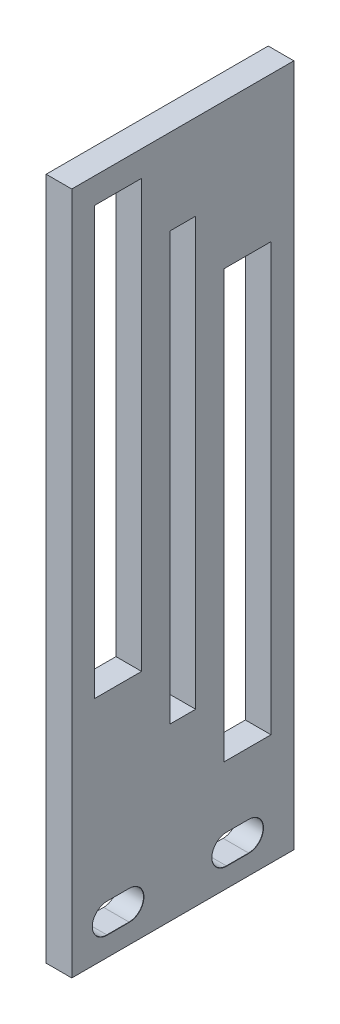
ISO-10303-21;
HEADER;
FILE_DESCRIPTION(('STEP AP214'),'2;1');
FILE_NAME('part.step','',(''),(''),'','','');
FILE_SCHEMA(('AUTOMOTIVE_DESIGN { 1 0 10303 214 1 1 1 1 }'));
ENDSEC;
DATA;
#1=APPLICATION_CONTEXT('core data for automotive mechanical design processes');
#2=APPLICATION_PROTOCOL_DEFINITION('international standard','automotive_design',2000,#1);
#3=PRODUCT_CONTEXT('',#1,'mechanical');
#4=PRODUCT('Part','Part','',(#3));
#5=PRODUCT_RELATED_PRODUCT_CATEGORY('part','',(#4));
#6=PRODUCT_DEFINITION_FORMATION('','',#4);
#7=PRODUCT_DEFINITION_CONTEXT('part definition',#1,'design');
#8=PRODUCT_DEFINITION('design','',#6,#7);
#9=PRODUCT_DEFINITION_SHAPE('','',#8);
#10=(LENGTH_UNIT() NAMED_UNIT(*) SI_UNIT(.MILLI.,.METRE.));
#11=(NAMED_UNIT(*) PLANE_ANGLE_UNIT() SI_UNIT($,.RADIAN.));
#12=(NAMED_UNIT(*) SI_UNIT($,.STERADIAN.) SOLID_ANGLE_UNIT());
#13=UNCERTAINTY_MEASURE_WITH_UNIT(LENGTH_MEASURE(1.E-05),#10,'distance_accuracy_value','');
#14=(GEOMETRIC_REPRESENTATION_CONTEXT(3) GLOBAL_UNCERTAINTY_ASSIGNED_CONTEXT((#13)) GLOBAL_UNIT_ASSIGNED_CONTEXT((#10,
#11,#12)) REPRESENTATION_CONTEXT('',''));
#15=CARTESIAN_POINT('',(0.,0.,0.));
#16=DIRECTION('',(0.,0.,1.));
#17=DIRECTION('',(1.,0.,0.));
#18=AXIS2_PLACEMENT_3D('',#15,#16,#17);
#19=CARTESIAN_POINT('',(3.,0.,0.));
#20=DIRECTION('',(0.,0.,-1.));
#21=DIRECTION('',(-1.,0.,0.));
#22=AXIS2_PLACEMENT_3D('',#19,#20,#21);
#23=PLANE('',#22);
#24=DIRECTION('',(0.,-1.,0.));
#25=VECTOR('',#24,1.);
#26=CARTESIAN_POINT('',(0.,0.,0.));
#27=LINE('',#26,#25);
#28=CARTESIAN_POINT('',(0.,80.,0.));
#29=VERTEX_POINT('',#28);
#30=CARTESIAN_POINT('',(0.,0.,0.));
#31=VERTEX_POINT('',#30);
#32=EDGE_CURVE('E540',#29,#31,#27,.T.);
#33=ORIENTED_EDGE('',*,*,#32,.T.);
#34=DIRECTION('',(-1.,0.,0.));
#35=VECTOR('',#34,1.);
#36=CARTESIAN_POINT('',(3.,0.,0.));
#37=LINE('',#36,#35);
#38=CARTESIAN_POINT('',(3.,0.,0.));
#39=VERTEX_POINT('',#38);
#40=EDGE_CURVE('E14',#39,#31,#37,.T.);
#41=ORIENTED_EDGE('',*,*,#40,.F.);
#42=DIRECTION('',(0.,-1.,0.));
#43=VECTOR('',#42,1.);
#44=CARTESIAN_POINT('',(3.,0.,0.));
#45=LINE('',#44,#43);
#46=CARTESIAN_POINT('',(3.,80.,0.));
#47=VERTEX_POINT('',#46);
#48=EDGE_CURVE('E625',#47,#39,#45,.T.);
#49=ORIENTED_EDGE('',*,*,#48,.F.);
#50=DIRECTION('',(-1.,0.,0.));
#51=VECTOR('',#50,1.);
#52=CARTESIAN_POINT('',(3.,80.,0.));
#53=LINE('',#52,#51);
#54=EDGE_CURVE('E642',#47,#29,#53,.T.);
#55=ORIENTED_EDGE('',*,*,#54,.T.);
#56=EDGE_LOOP('',(#33,#41,#49,#55));
#57=FACE_BOUND('',#56,.T.);
#58=ADVANCED_FACE('F185',(#57),#23,.F.);
#59=CARTESIAN_POINT('',(3.,0.,0.));
#60=DIRECTION('',(0.,1.,0.));
#61=DIRECTION('',(0.,0.,1.));
#62=AXIS2_PLACEMENT_3D('',#59,#60,#61);
#63=PLANE('',#62);
#64=DIRECTION('',(0.,0.,-1.));
#65=VECTOR('',#64,1.);
#66=CARTESIAN_POINT('',(0.,0.,0.));
#67=LINE('',#66,#65);
#68=CARTESIAN_POINT('',(0.,0.,-26.));
#69=VERTEX_POINT('',#68);
#70=EDGE_CURVE('E645',#31,#69,#67,.T.);
#71=ORIENTED_EDGE('',*,*,#70,.T.);
#72=DIRECTION('',(-1.,0.,0.));
#73=VECTOR('',#72,1.);
#74=CARTESIAN_POINT('',(3.,0.,-26.));
#75=LINE('',#74,#73);
#76=CARTESIAN_POINT('',(3.,0.,-26.));
#77=VERTEX_POINT('',#76);
#78=EDGE_CURVE('E192',#77,#69,#75,.T.);
#79=ORIENTED_EDGE('',*,*,#78,.F.);
#80=DIRECTION('',(0.,0.,-1.));
#81=VECTOR('',#80,1.);
#82=CARTESIAN_POINT('',(3.,0.,0.));
#83=LINE('',#82,#81);
#84=EDGE_CURVE('E630',#39,#77,#83,.T.);
#85=ORIENTED_EDGE('',*,*,#84,.F.);
#86=ORIENTED_EDGE('',*,*,#40,.T.);
#87=EDGE_LOOP('',(#71,#79,#85,#86));
#88=FACE_BOUND('',#87,.T.);
#89=ADVANCED_FACE('F757',(#88),#63,.F.);
#90=CARTESIAN_POINT('',(3.,0.,-26.));
#91=DIRECTION('',(0.,0.,1.));
#92=DIRECTION('',(1.,0.,0.));
#93=AXIS2_PLACEMENT_3D('',#90,#91,#92);
#94=PLANE('',#93);
#95=DIRECTION('',(0.,1.,0.));
#96=VECTOR('',#95,1.);
#97=CARTESIAN_POINT('',(0.,0.,-26.));
#98=LINE('',#97,#96);
#99=CARTESIAN_POINT('',(0.,80.,-26.));
#100=VERTEX_POINT('',#99);
#101=EDGE_CURVE('E647',#69,#100,#98,.T.);
#102=ORIENTED_EDGE('',*,*,#101,.T.);
#103=DIRECTION('',(-1.,0.,0.));
#104=VECTOR('',#103,1.);
#105=CARTESIAN_POINT('',(3.,80.,-26.));
#106=LINE('',#105,#104);
#107=CARTESIAN_POINT('',(3.,80.,-26.));
#108=VERTEX_POINT('',#107);
#109=EDGE_CURVE('E652',#108,#100,#106,.T.);
#110=ORIENTED_EDGE('',*,*,#109,.F.);
#111=DIRECTION('',(0.,1.,0.));
#112=VECTOR('',#111,1.);
#113=CARTESIAN_POINT('',(3.,0.,-26.));
#114=LINE('',#113,#112);
#115=EDGE_CURVE('E635',#77,#108,#114,.T.);
#116=ORIENTED_EDGE('',*,*,#115,.F.);
#117=ORIENTED_EDGE('',*,*,#78,.T.);
#118=EDGE_LOOP('',(#102,#110,#116,#117));
#119=FACE_BOUND('',#118,.T.);
#120=ADVANCED_FACE('F659',(#119),#94,.F.);
#121=CARTESIAN_POINT('',(3.,80.,0.));
#122=DIRECTION('',(0.,-1.,0.));
#123=DIRECTION('',(0.,0.,-1.));
#124=AXIS2_PLACEMENT_3D('',#121,#122,#123);
#125=PLANE('',#124);
#126=DIRECTION('',(0.,0.,1.));
#127=VECTOR('',#126,1.);
#128=CARTESIAN_POINT('',(0.,80.,0.));
#129=LINE('',#128,#127);
#130=EDGE_CURVE('E631',#100,#29,#129,.T.);
#131=ORIENTED_EDGE('',*,*,#130,.T.);
#132=ORIENTED_EDGE('',*,*,#54,.F.);
#133=DIRECTION('',(0.,0.,1.));
#134=VECTOR('',#133,1.);
#135=CARTESIAN_POINT('',(3.,80.,0.));
#136=LINE('',#135,#134);
#137=EDGE_CURVE('E638',#108,#47,#136,.T.);
#138=ORIENTED_EDGE('',*,*,#137,.F.);
#139=ORIENTED_EDGE('',*,*,#109,.T.);
#140=EDGE_LOOP('',(#131,#132,#138,#139));
#141=FACE_BOUND('',#140,.T.);
#142=ADVANCED_FACE('F667',(#141),#125,.F.);
#143=CARTESIAN_POINT('',(3.,0.,0.));
#144=DIRECTION('',(-1.,0.,0.));
#145=DIRECTION('',(0.,0.,1.));
#146=AXIS2_PLACEMENT_3D('',#143,#144,#145);
#147=PLANE('',#146);
#148=DIRECTION('',(0.,0.,1.));
#149=VECTOR('',#148,1.);
#150=CARTESIAN_POINT('',(3.,2.275,-6.725));
#151=LINE('',#150,#149);
#152=CARTESIAN_POINT('',(3.,2.27499999999994,-6.725));
#153=VERTEX_POINT('',#152);
#154=CARTESIAN_POINT('',(3.,2.275,-4.125));
#155=VERTEX_POINT('',#154);
#156=EDGE_CURVE('E400',#153,#155,#151,.T.);
#157=ORIENTED_EDGE('',*,*,#156,.T.);
#158=CARTESIAN_POINT('',(3.,4.,-4.125));
#159=DIRECTION('',(1.,0.,0.));
#160=DIRECTION('',(0.,0.,-1.));
#161=AXIS2_PLACEMENT_3D('',#158,#159,#160);
#162=CIRCLE('',#161,1.725);
#163=CARTESIAN_POINT('',(3.,5.72499999999999,-4.125));
#164=VERTEX_POINT('',#163);
#165=EDGE_CURVE('E689',#164,#155,#162,.T.);
#166=ORIENTED_EDGE('',*,*,#165,.F.);
#167=DIRECTION('',(0.,0.,1.));
#168=VECTOR('',#167,1.);
#169=CARTESIAN_POINT('',(3.,5.72499999999999,-6.725));
#170=LINE('',#169,#168);
#171=CARTESIAN_POINT('',(3.,5.725,-6.725));
#172=VERTEX_POINT('',#171);
#173=EDGE_CURVE('E394',#172,#164,#170,.T.);
#174=ORIENTED_EDGE('',*,*,#173,.F.);
#175=CARTESIAN_POINT('',(3.,4.,-6.725));
#176=DIRECTION('',(1.,0.,0.));
#177=DIRECTION('',(0.,0.,-1.));
#178=AXIS2_PLACEMENT_3D('',#175,#176,#177);
#179=CIRCLE('',#178,1.725);
#180=EDGE_CURVE('E378',#153,#172,#179,.T.);
#181=ORIENTED_EDGE('',*,*,#180,.F.);
#182=EDGE_LOOP('',(#157,#166,#174,#181));
#183=FACE_BOUND('',#182,.T.);
#184=CARTESIAN_POINT('',(3.,4.,-20.725));
#185=DIRECTION('',(1.,0.,0.));
#186=DIRECTION('',(0.,0.,-1.));
#187=AXIS2_PLACEMENT_3D('',#184,#185,#186);
#188=CIRCLE('',#187,1.725);
#189=CARTESIAN_POINT('',(3.,2.27499999999994,-20.725));
#190=VERTEX_POINT('',#189);
#191=CARTESIAN_POINT('',(3.,5.725,-20.725));
#192=VERTEX_POINT('',#191);
#193=EDGE_CURVE('E416',#190,#192,#188,.T.);
#194=ORIENTED_EDGE('',*,*,#193,.F.);
#195=DIRECTION('',(0.,0.,1.));
#196=VECTOR('',#195,1.);
#197=CARTESIAN_POINT('',(3.,2.275,-20.725));
#198=LINE('',#197,#196);
#199=CARTESIAN_POINT('',(3.,2.275,-18.125));
#200=VERTEX_POINT('',#199);
#201=EDGE_CURVE('E469',#190,#200,#198,.T.);
#202=ORIENTED_EDGE('',*,*,#201,.T.);
#203=CARTESIAN_POINT('',(3.,4.,-18.125));
#204=DIRECTION('',(1.,0.,0.));
#205=DIRECTION('',(0.,0.,-1.));
#206=AXIS2_PLACEMENT_3D('',#203,#204,#205);
#207=CIRCLE('',#206,1.725);
#208=CARTESIAN_POINT('',(3.,5.72499999999999,-18.125));
#209=VERTEX_POINT('',#208);
#210=EDGE_CURVE('E441',#209,#200,#207,.T.);
#211=ORIENTED_EDGE('',*,*,#210,.F.);
#212=DIRECTION('',(0.,0.,1.));
#213=VECTOR('',#212,1.);
#214=CARTESIAN_POINT('',(3.,5.72499999999999,-20.725));
#215=LINE('',#214,#213);
#216=EDGE_CURVE('E453',#192,#209,#215,.T.);
#217=ORIENTED_EDGE('',*,*,#216,.F.);
#218=EDGE_LOOP('',(#194,#202,#211,#217));
#219=FACE_BOUND('',#218,.T.);
#220=DIRECTION('',(0.,0.,-1.));
#221=VECTOR('',#220,1.);
#222=CARTESIAN_POINT('',(3.,27.,-2.67500000000001));
#223=LINE('',#222,#221);
#224=CARTESIAN_POINT('',(3.,27.,-2.67500000000001));
#225=VERTEX_POINT('',#224);
#226=CARTESIAN_POINT('',(3.,27.,-8.17499999999999));
#227=VERTEX_POINT('',#226);
#228=EDGE_CURVE('E524',#225,#227,#223,.T.);
#229=ORIENTED_EDGE('',*,*,#228,.F.);
#230=DIRECTION('',(0.,-1.,0.));
#231=VECTOR('',#230,1.);
#232=CARTESIAN_POINT('',(3.,77.,-2.675));
#233=LINE('',#232,#231);
#234=CARTESIAN_POINT('',(3.,77.,-2.675));
#235=VERTEX_POINT('',#234);
#236=EDGE_CURVE('E521',#235,#225,#233,.T.);
#237=ORIENTED_EDGE('',*,*,#236,.F.);
#238=DIRECTION('',(0.,0.,1.));
#239=VECTOR('',#238,1.);
#240=CARTESIAN_POINT('',(3.,77.,-2.675));
#241=LINE('',#240,#239);
#242=CARTESIAN_POINT('',(3.,77.,-8.175));
#243=VERTEX_POINT('',#242);
#244=EDGE_CURVE('E511',#243,#235,#241,.T.);
#245=ORIENTED_EDGE('',*,*,#244,.F.);
#246=DIRECTION('',(0.,1.,0.));
#247=VECTOR('',#246,1.);
#248=CARTESIAN_POINT('',(3.,77.,-8.175));
#249=LINE('',#248,#247);
#250=EDGE_CURVE('E536',#227,#243,#249,.T.);
#251=ORIENTED_EDGE('',*,*,#250,.F.);
#252=EDGE_LOOP('',(#229,#237,#245,#251));
#253=FACE_BOUND('',#252,.T.);
#254=DIRECTION('',(0.,0.,-1.));
#255=VECTOR('',#254,1.);
#256=CARTESIAN_POINT('',(3.,20.,-11.5));
#257=LINE('',#256,#255);
#258=CARTESIAN_POINT('',(3.,20.,-11.5));
#259=VERTEX_POINT('',#258);
#260=CARTESIAN_POINT('',(3.,20.,-14.5));
#261=VERTEX_POINT('',#260);
#262=EDGE_CURVE('E565',#259,#261,#257,.T.);
#263=ORIENTED_EDGE('',*,*,#262,.F.);
#264=DIRECTION('',(0.,-1.,0.));
#265=VECTOR('',#264,1.);
#266=CARTESIAN_POINT('',(3.,70.,-11.5));
#267=LINE('',#266,#265);
#268=CARTESIAN_POINT('',(3.,70.,-11.5));
#269=VERTEX_POINT('',#268);
#270=EDGE_CURVE('E561',#269,#259,#267,.T.);
#271=ORIENTED_EDGE('',*,*,#270,.F.);
#272=DIRECTION('',(0.,0.,1.));
#273=VECTOR('',#272,1.);
#274=CARTESIAN_POINT('',(3.,70.,-11.5));
#275=LINE('',#274,#273);
#276=CARTESIAN_POINT('',(3.,70.,-14.5));
#277=VERTEX_POINT('',#276);
#278=EDGE_CURVE('E551',#277,#269,#275,.T.);
#279=ORIENTED_EDGE('',*,*,#278,.F.);
#280=DIRECTION('',(0.,1.,0.));
#281=VECTOR('',#280,1.);
#282=CARTESIAN_POINT('',(3.,70.,-14.5));
#283=LINE('',#282,#281);
#284=EDGE_CURVE('E578',#261,#277,#283,.T.);
#285=ORIENTED_EDGE('',*,*,#284,.F.);
#286=EDGE_LOOP('',(#263,#271,#279,#285));
#287=FACE_BOUND('',#286,.T.);
#288=DIRECTION('',(0.,0.,-1.));
#289=VECTOR('',#288,1.);
#290=CARTESIAN_POINT('',(3.,13.,-17.825));
#291=LINE('',#290,#289);
#292=CARTESIAN_POINT('',(3.,13.,-17.825));
#293=VERTEX_POINT('',#292);
#294=CARTESIAN_POINT('',(3.,13.,-23.325));
#295=VERTEX_POINT('',#294);
#296=EDGE_CURVE('E604',#293,#295,#291,.T.);
#297=ORIENTED_EDGE('',*,*,#296,.F.);
#298=DIRECTION('',(0.,-1.,0.));
#299=VECTOR('',#298,1.);
#300=CARTESIAN_POINT('',(3.,63.,-17.825));
#301=LINE('',#300,#299);
#302=CARTESIAN_POINT('',(3.,63.,-17.825));
#303=VERTEX_POINT('',#302);
#304=EDGE_CURVE('E504',#303,#293,#301,.T.);
#305=ORIENTED_EDGE('',*,*,#304,.F.);
#306=DIRECTION('',(0.,0.,1.));
#307=VECTOR('',#306,1.);
#308=CARTESIAN_POINT('',(3.,63.,-17.825));
#309=LINE('',#308,#307);
#310=CARTESIAN_POINT('',(3.,63.,-23.325));
#311=VERTEX_POINT('',#310);
#312=EDGE_CURVE('E591',#311,#303,#309,.T.);
#313=ORIENTED_EDGE('',*,*,#312,.F.);
#314=DIRECTION('',(0.,1.,0.));
#315=VECTOR('',#314,1.);
#316=CARTESIAN_POINT('',(3.,63.,-23.325));
#317=LINE('',#316,#315);
#318=EDGE_CURVE('E616',#295,#311,#317,.T.);
#319=ORIENTED_EDGE('',*,*,#318,.F.);
#320=EDGE_LOOP('',(#297,#305,#313,#319));
#321=FACE_BOUND('',#320,.T.);
#322=ORIENTED_EDGE('',*,*,#48,.T.);
#323=ORIENTED_EDGE('',*,*,#84,.T.);
#324=ORIENTED_EDGE('',*,*,#115,.T.);
#325=ORIENTED_EDGE('',*,*,#137,.T.);
#326=EDGE_LOOP('',(#322,#323,#324,#325));
#327=FACE_BOUND('',#326,.T.);
#328=ADVANCED_FACE('F673',(#183,#219,#253,#287,#321,#327),#147,.F.);
#329=CARTESIAN_POINT('',(0.,0.,0.));
#330=DIRECTION('',(-1.,0.,0.));
#331=DIRECTION('',(0.,0.,1.));
#332=AXIS2_PLACEMENT_3D('',#329,#330,#331);
#333=PLANE('',#332);
#334=DIRECTION('',(0.,0.,1.));
#335=VECTOR('',#334,1.);
#336=CARTESIAN_POINT('',(0.,2.3,-6.725));
#337=LINE('',#336,#335);
#338=CARTESIAN_POINT('',(0.,2.3,-6.725));
#339=VERTEX_POINT('',#338);
#340=CARTESIAN_POINT('',(0.,2.3,-4.125));
#341=VERTEX_POINT('',#340);
#342=EDGE_CURVE('E698',#339,#341,#337,.T.);
#343=ORIENTED_EDGE('',*,*,#342,.F.);
#344=CARTESIAN_POINT('',(0.,4.,-6.725));
#345=DIRECTION('',(1.,0.,0.));
#346=DIRECTION('',(0.,0.,-1.));
#347=AXIS2_PLACEMENT_3D('',#344,#345,#346);
#348=CIRCLE('',#347,1.7);
#349=CARTESIAN_POINT('',(0.,5.7,-6.725));
#350=VERTEX_POINT('',#349);
#351=EDGE_CURVE('E388',#339,#350,#348,.T.);
#352=ORIENTED_EDGE('',*,*,#351,.T.);
#353=DIRECTION('',(0.,0.,1.));
#354=VECTOR('',#353,1.);
#355=CARTESIAN_POINT('',(0.,5.7,-6.725));
#356=LINE('',#355,#354);
#357=CARTESIAN_POINT('',(0.,5.7,-4.125));
#358=VERTEX_POINT('',#357);
#359=EDGE_CURVE('E374',#350,#358,#356,.T.);
#360=ORIENTED_EDGE('',*,*,#359,.T.);
#361=CARTESIAN_POINT('',(0.,4.,-4.125));
#362=DIRECTION('',(1.,0.,0.));
#363=DIRECTION('',(0.,0.,-1.));
#364=AXIS2_PLACEMENT_3D('',#361,#362,#363);
#365=CIRCLE('',#364,1.7);
#366=EDGE_CURVE('E708',#358,#341,#365,.T.);
#367=ORIENTED_EDGE('',*,*,#366,.T.);
#368=EDGE_LOOP('',(#343,#352,#360,#367));
#369=FACE_BOUND('',#368,.T.);
#370=CARTESIAN_POINT('',(0.,4.,-18.125));
#371=DIRECTION('',(1.,0.,0.));
#372=DIRECTION('',(0.,0.,-1.));
#373=AXIS2_PLACEMENT_3D('',#370,#371,#372);
#374=CIRCLE('',#373,1.7);
#375=CARTESIAN_POINT('',(0.,5.7,-18.125));
#376=VERTEX_POINT('',#375);
#377=CARTESIAN_POINT('',(0.,2.3,-18.125));
#378=VERTEX_POINT('',#377);
#379=EDGE_CURVE('E491',#376,#378,#374,.T.);
#380=ORIENTED_EDGE('',*,*,#379,.T.);
#381=DIRECTION('',(0.,0.,1.));
#382=VECTOR('',#381,1.);
#383=CARTESIAN_POINT('',(0.,2.3,-20.725));
#384=LINE('',#383,#382);
#385=CARTESIAN_POINT('',(0.,2.3,-20.725));
#386=VERTEX_POINT('',#385);
#387=EDGE_CURVE('E466',#386,#378,#384,.T.);
#388=ORIENTED_EDGE('',*,*,#387,.F.);
#389=CARTESIAN_POINT('',(0.,4.,-20.725));
#390=DIRECTION('',(1.,0.,0.));
#391=DIRECTION('',(0.,0.,-1.));
#392=AXIS2_PLACEMENT_3D('',#389,#390,#391);
#393=CIRCLE('',#392,1.7);
#394=CARTESIAN_POINT('',(0.,5.7,-20.725));
#395=VERTEX_POINT('',#394);
#396=EDGE_CURVE('E427',#386,#395,#393,.T.);
#397=ORIENTED_EDGE('',*,*,#396,.T.);
#398=DIRECTION('',(0.,0.,1.));
#399=VECTOR('',#398,1.);
#400=CARTESIAN_POINT('',(0.,5.7,-20.725));
#401=LINE('',#400,#399);
#402=EDGE_CURVE('E463',#395,#376,#401,.T.);
#403=ORIENTED_EDGE('',*,*,#402,.T.);
#404=EDGE_LOOP('',(#380,#388,#397,#403));
#405=FACE_BOUND('',#404,.T.);
#406=DIRECTION('',(0.,-1.,0.));
#407=VECTOR('',#406,1.);
#408=CARTESIAN_POINT('',(0.,77.,-2.675));
#409=LINE('',#408,#407);
#410=CARTESIAN_POINT('',(0.,77.,-2.675));
#411=VERTEX_POINT('',#410);
#412=CARTESIAN_POINT('',(0.,27.,-2.67500000000001));
#413=VERTEX_POINT('',#412);
#414=EDGE_CURVE('E507',#411,#413,#409,.T.);
#415=ORIENTED_EDGE('',*,*,#414,.T.);
#416=DIRECTION('',(0.,0.,-1.));
#417=VECTOR('',#416,1.);
#418=CARTESIAN_POINT('',(0.,27.,-2.67500000000001));
#419=LINE('',#418,#417);
#420=CARTESIAN_POINT('',(0.,27.,-8.17499999999999));
#421=VERTEX_POINT('',#420);
#422=EDGE_CURVE('E510',#413,#421,#419,.T.);
#423=ORIENTED_EDGE('',*,*,#422,.T.);
#424=DIRECTION('',(0.,1.,0.));
#425=VECTOR('',#424,1.);
#426=CARTESIAN_POINT('',(0.,77.,-8.175));
#427=LINE('',#426,#425);
#428=CARTESIAN_POINT('',(0.,77.,-8.175));
#429=VERTEX_POINT('',#428);
#430=EDGE_CURVE('E514',#421,#429,#427,.T.);
#431=ORIENTED_EDGE('',*,*,#430,.T.);
#432=DIRECTION('',(0.,0.,1.));
#433=VECTOR('',#432,1.);
#434=CARTESIAN_POINT('',(0.,77.,-2.675));
#435=LINE('',#434,#433);
#436=EDGE_CURVE('E517',#429,#411,#435,.T.);
#437=ORIENTED_EDGE('',*,*,#436,.T.);
#438=EDGE_LOOP('',(#415,#423,#431,#437));
#439=FACE_BOUND('',#438,.T.);
#440=DIRECTION('',(0.,-1.,0.));
#441=VECTOR('',#440,1.);
#442=CARTESIAN_POINT('',(0.,70.,-11.5));
#443=LINE('',#442,#441);
#444=CARTESIAN_POINT('',(0.,70.,-11.5));
#445=VERTEX_POINT('',#444);
#446=CARTESIAN_POINT('',(0.,20.,-11.5));
#447=VERTEX_POINT('',#446);
#448=EDGE_CURVE('E547',#445,#447,#443,.T.);
#449=ORIENTED_EDGE('',*,*,#448,.T.);
#450=DIRECTION('',(0.,0.,-1.));
#451=VECTOR('',#450,1.);
#452=CARTESIAN_POINT('',(0.,20.,-11.5));
#453=LINE('',#452,#451);
#454=CARTESIAN_POINT('',(0.,20.,-14.5));
#455=VERTEX_POINT('',#454);
#456=EDGE_CURVE('E550',#447,#455,#453,.T.);
#457=ORIENTED_EDGE('',*,*,#456,.T.);
#458=DIRECTION('',(0.,1.,0.));
#459=VECTOR('',#458,1.);
#460=CARTESIAN_POINT('',(0.,70.,-14.5));
#461=LINE('',#460,#459);
#462=CARTESIAN_POINT('',(0.,70.,-14.5));
#463=VERTEX_POINT('',#462);
#464=EDGE_CURVE('E554',#455,#463,#461,.T.);
#465=ORIENTED_EDGE('',*,*,#464,.T.);
#466=DIRECTION('',(0.,0.,1.));
#467=VECTOR('',#466,1.);
#468=CARTESIAN_POINT('',(0.,70.,-11.5));
#469=LINE('',#468,#467);
#470=EDGE_CURVE('E557',#463,#445,#469,.T.);
#471=ORIENTED_EDGE('',*,*,#470,.T.);
#472=EDGE_LOOP('',(#449,#457,#465,#471));
#473=FACE_BOUND('',#472,.T.);
#474=DIRECTION('',(0.,-1.,0.));
#475=VECTOR('',#474,1.);
#476=CARTESIAN_POINT('',(0.,63.,-17.825));
#477=LINE('',#476,#475);
#478=CARTESIAN_POINT('',(0.,63.,-17.825));
#479=VERTEX_POINT('',#478);
#480=CARTESIAN_POINT('',(0.,13.,-17.825));
#481=VERTEX_POINT('',#480);
#482=EDGE_CURVE('E587',#479,#481,#477,.T.);
#483=ORIENTED_EDGE('',*,*,#482,.T.);
#484=DIRECTION('',(0.,0.,-1.));
#485=VECTOR('',#484,1.);
#486=CARTESIAN_POINT('',(0.,13.,-17.825));
#487=LINE('',#486,#485);
#488=CARTESIAN_POINT('',(0.,13.,-23.325));
#489=VERTEX_POINT('',#488);
#490=EDGE_CURVE('E590',#481,#489,#487,.T.);
#491=ORIENTED_EDGE('',*,*,#490,.T.);
#492=DIRECTION('',(0.,1.,0.));
#493=VECTOR('',#492,1.);
#494=CARTESIAN_POINT('',(0.,63.,-23.325));
#495=LINE('',#494,#493);
#496=CARTESIAN_POINT('',(0.,63.,-23.325));
#497=VERTEX_POINT('',#496);
#498=EDGE_CURVE('E594',#489,#497,#495,.T.);
#499=ORIENTED_EDGE('',*,*,#498,.T.);
#500=DIRECTION('',(0.,0.,1.));
#501=VECTOR('',#500,1.);
#502=CARTESIAN_POINT('',(0.,63.,-17.825));
#503=LINE('',#502,#501);
#504=EDGE_CURVE('E597',#497,#479,#503,.T.);
#505=ORIENTED_EDGE('',*,*,#504,.T.);
#506=EDGE_LOOP('',(#483,#491,#499,#505));
#507=FACE_BOUND('',#506,.T.);
#508=ORIENTED_EDGE('',*,*,#32,.F.);
#509=ORIENTED_EDGE('',*,*,#130,.F.);
#510=ORIENTED_EDGE('',*,*,#101,.F.);
#511=ORIENTED_EDGE('',*,*,#70,.F.);
#512=EDGE_LOOP('',(#508,#509,#510,#511));
#513=FACE_BOUND('',#512,.T.);
#514=ADVANCED_FACE('F489',(#369,#405,#439,#473,#507,#513),#333,.T.);
#515=CARTESIAN_POINT('',(0.,63.,-17.825));
#516=DIRECTION('',(0.,0.,1.));
#517=DIRECTION('',(0.,-1.,0.));
#518=AXIS2_PLACEMENT_3D('',#515,#516,#517);
#519=PLANE('',#518);
#520=ORIENTED_EDGE('',*,*,#304,.T.);
#521=DIRECTION('',(1.,0.,0.));
#522=VECTOR('',#521,1.);
#523=CARTESIAN_POINT('',(0.,13.,-17.825));
#524=LINE('',#523,#522);
#525=EDGE_CURVE('E600',#481,#293,#524,.T.);
#526=ORIENTED_EDGE('',*,*,#525,.F.);
#527=ORIENTED_EDGE('',*,*,#482,.F.);
#528=DIRECTION('',(1.,0.,0.));
#529=VECTOR('',#528,1.);
#530=CARTESIAN_POINT('',(0.,63.,-17.825));
#531=LINE('',#530,#529);
#532=EDGE_CURVE('E566',#479,#303,#531,.T.);
#533=ORIENTED_EDGE('',*,*,#532,.T.);
#534=EDGE_LOOP('',(#520,#526,#527,#533));
#535=FACE_BOUND('',#534,.T.);
#536=ADVANCED_FACE('F742',(#535),#519,.F.);
#537=CARTESIAN_POINT('',(0.,63.,-17.825));
#538=DIRECTION('',(0.,1.,0.));
#539=DIRECTION('',(0.,0.,1.));
#540=AXIS2_PLACEMENT_3D('',#537,#538,#539);
#541=PLANE('',#540);
#542=ORIENTED_EDGE('',*,*,#312,.T.);
#543=ORIENTED_EDGE('',*,*,#532,.F.);
#544=ORIENTED_EDGE('',*,*,#504,.F.);
#545=DIRECTION('',(1.,0.,0.));
#546=VECTOR('',#545,1.);
#547=CARTESIAN_POINT('',(0.,63.,-23.325));
#548=LINE('',#547,#546);
#549=EDGE_CURVE('E619',#497,#311,#548,.T.);
#550=ORIENTED_EDGE('',*,*,#549,.T.);
#551=EDGE_LOOP('',(#542,#543,#544,#550));
#552=FACE_BOUND('',#551,.T.);
#553=ADVANCED_FACE('F745',(#552),#541,.F.);
#554=CARTESIAN_POINT('',(0.,63.,-23.325));
#555=DIRECTION('',(0.,0.,-1.));
#556=DIRECTION('',(0.,1.,0.));
#557=AXIS2_PLACEMENT_3D('',#554,#555,#556);
#558=PLANE('',#557);
#559=ORIENTED_EDGE('',*,*,#318,.T.);
#560=ORIENTED_EDGE('',*,*,#549,.F.);
#561=ORIENTED_EDGE('',*,*,#498,.F.);
#562=DIRECTION('',(1.,0.,0.));
#563=VECTOR('',#562,1.);
#564=CARTESIAN_POINT('',(0.,13.,-23.325));
#565=LINE('',#564,#563);
#566=EDGE_CURVE('E621',#489,#295,#565,.T.);
#567=ORIENTED_EDGE('',*,*,#566,.T.);
#568=EDGE_LOOP('',(#559,#560,#561,#567));
#569=FACE_BOUND('',#568,.T.);
#570=ADVANCED_FACE('F747',(#569),#558,.F.);
#571=CARTESIAN_POINT('',(0.,13.,-17.825));
#572=DIRECTION('',(0.,-1.,0.));
#573=DIRECTION('',(0.,0.,-1.));
#574=AXIS2_PLACEMENT_3D('',#571,#572,#573);
#575=PLANE('',#574);
#576=ORIENTED_EDGE('',*,*,#296,.T.);
#577=ORIENTED_EDGE('',*,*,#566,.F.);
#578=ORIENTED_EDGE('',*,*,#490,.F.);
#579=ORIENTED_EDGE('',*,*,#525,.T.);
#580=EDGE_LOOP('',(#576,#577,#578,#579));
#581=FACE_BOUND('',#580,.T.);
#582=ADVANCED_FACE('F738',(#581),#575,.F.);
#583=CARTESIAN_POINT('',(0.,70.,-11.5));
#584=DIRECTION('',(0.,0.,1.));
#585=DIRECTION('',(0.,-1.,0.));
#586=AXIS2_PLACEMENT_3D('',#583,#584,#585);
#587=PLANE('',#586);
#588=ORIENTED_EDGE('',*,*,#270,.T.);
#589=DIRECTION('',(1.,0.,0.));
#590=VECTOR('',#589,1.);
#591=CARTESIAN_POINT('',(0.,20.,-11.5));
#592=LINE('',#591,#590);
#593=EDGE_CURVE('E560',#447,#259,#592,.T.);
#594=ORIENTED_EDGE('',*,*,#593,.F.);
#595=ORIENTED_EDGE('',*,*,#448,.F.);
#596=DIRECTION('',(1.,0.,0.));
#597=VECTOR('',#596,1.);
#598=CARTESIAN_POINT('',(0.,70.,-11.5));
#599=LINE('',#598,#597);
#600=EDGE_CURVE('E525',#445,#269,#599,.T.);
#601=ORIENTED_EDGE('',*,*,#600,.T.);
#602=EDGE_LOOP('',(#588,#594,#595,#601));
#603=FACE_BOUND('',#602,.T.);
#604=ADVANCED_FACE('F949',(#603),#587,.F.);
#605=CARTESIAN_POINT('',(0.,70.,-11.5));
#606=DIRECTION('',(0.,1.,0.));
#607=DIRECTION('',(0.,0.,1.));
#608=AXIS2_PLACEMENT_3D('',#605,#606,#607);
#609=PLANE('',#608);
#610=ORIENTED_EDGE('',*,*,#278,.T.);
#611=ORIENTED_EDGE('',*,*,#600,.F.);
#612=ORIENTED_EDGE('',*,*,#470,.F.);
#613=DIRECTION('',(1.,0.,0.));
#614=VECTOR('',#613,1.);
#615=CARTESIAN_POINT('',(0.,70.,-14.5));
#616=LINE('',#615,#614);
#617=EDGE_CURVE('E581',#463,#277,#616,.T.);
#618=ORIENTED_EDGE('',*,*,#617,.T.);
#619=EDGE_LOOP('',(#610,#611,#612,#618));
#620=FACE_BOUND('',#619,.T.);
#621=ADVANCED_FACE('F945',(#620),#609,.F.);
#622=CARTESIAN_POINT('',(0.,70.,-14.5));
#623=DIRECTION('',(0.,0.,-1.));
#624=DIRECTION('',(0.,1.,0.));
#625=AXIS2_PLACEMENT_3D('',#622,#623,#624);
#626=PLANE('',#625);
#627=ORIENTED_EDGE('',*,*,#284,.T.);
#628=ORIENTED_EDGE('',*,*,#617,.F.);
#629=ORIENTED_EDGE('',*,*,#464,.F.);
#630=DIRECTION('',(1.,0.,0.));
#631=VECTOR('',#630,1.);
#632=CARTESIAN_POINT('',(0.,20.,-14.5));
#633=LINE('',#632,#631);
#634=EDGE_CURVE('E583',#455,#261,#633,.T.);
#635=ORIENTED_EDGE('',*,*,#634,.T.);
#636=EDGE_LOOP('',(#627,#628,#629,#635));
#637=FACE_BOUND('',#636,.T.);
#638=ADVANCED_FACE('F948',(#637),#626,.F.);
#639=CARTESIAN_POINT('',(0.,20.,-11.5));
#640=DIRECTION('',(0.,-1.,0.));
#641=DIRECTION('',(0.,0.,-1.));
#642=AXIS2_PLACEMENT_3D('',#639,#640,#641);
#643=PLANE('',#642);
#644=ORIENTED_EDGE('',*,*,#262,.T.);
#645=ORIENTED_EDGE('',*,*,#634,.F.);
#646=ORIENTED_EDGE('',*,*,#456,.F.);
#647=ORIENTED_EDGE('',*,*,#593,.T.);
#648=EDGE_LOOP('',(#644,#645,#646,#647));
#649=FACE_BOUND('',#648,.T.);
#650=ADVANCED_FACE('F943',(#649),#643,.F.);
#651=CARTESIAN_POINT('',(0.,77.,-2.675));
#652=DIRECTION('',(0.,0.,1.));
#653=DIRECTION('',(0.,-1.,0.));
#654=AXIS2_PLACEMENT_3D('',#651,#652,#653);
#655=PLANE('',#654);
#656=ORIENTED_EDGE('',*,*,#236,.T.);
#657=DIRECTION('',(1.,0.,0.));
#658=VECTOR('',#657,1.);
#659=CARTESIAN_POINT('',(0.,27.,-2.67500000000001));
#660=LINE('',#659,#658);
#661=EDGE_CURVE('E520',#413,#225,#660,.T.);
#662=ORIENTED_EDGE('',*,*,#661,.F.);
#663=ORIENTED_EDGE('',*,*,#414,.F.);
#664=DIRECTION('',(1.,0.,0.));
#665=VECTOR('',#664,1.);
#666=CARTESIAN_POINT('',(0.,77.,-2.675));
#667=LINE('',#666,#665);
#668=EDGE_CURVE('E538',#411,#235,#667,.T.);
#669=ORIENTED_EDGE('',*,*,#668,.T.);
#670=EDGE_LOOP('',(#656,#662,#663,#669));
#671=FACE_BOUND('',#670,.T.);
#672=ADVANCED_FACE('F934',(#671),#655,.F.);
#673=CARTESIAN_POINT('',(0.,77.,-2.675));
#674=DIRECTION('',(0.,1.,0.));
#675=DIRECTION('',(0.,0.,1.));
#676=AXIS2_PLACEMENT_3D('',#673,#674,#675);
#677=PLANE('',#676);
#678=ORIENTED_EDGE('',*,*,#244,.T.);
#679=ORIENTED_EDGE('',*,*,#668,.F.);
#680=ORIENTED_EDGE('',*,*,#436,.F.);
#681=DIRECTION('',(1.,0.,0.));
#682=VECTOR('',#681,1.);
#683=CARTESIAN_POINT('',(0.,77.,-8.175));
#684=LINE('',#683,#682);
#685=EDGE_CURVE('E541',#429,#243,#684,.T.);
#686=ORIENTED_EDGE('',*,*,#685,.T.);
#687=EDGE_LOOP('',(#678,#679,#680,#686));
#688=FACE_BOUND('',#687,.T.);
#689=ADVANCED_FACE('F930',(#688),#677,.F.);
#690=CARTESIAN_POINT('',(0.,77.,-8.175));
#691=DIRECTION('',(0.,0.,-1.));
#692=DIRECTION('',(0.,1.,0.));
#693=AXIS2_PLACEMENT_3D('',#690,#691,#692);
#694=PLANE('',#693);
#695=ORIENTED_EDGE('',*,*,#250,.T.);
#696=ORIENTED_EDGE('',*,*,#685,.F.);
#697=ORIENTED_EDGE('',*,*,#430,.F.);
#698=DIRECTION('',(1.,0.,0.));
#699=VECTOR('',#698,1.);
#700=CARTESIAN_POINT('',(0.,27.,-8.17499999999999));
#701=LINE('',#700,#699);
#702=EDGE_CURVE('E543',#421,#227,#701,.T.);
#703=ORIENTED_EDGE('',*,*,#702,.T.);
#704=EDGE_LOOP('',(#695,#696,#697,#703));
#705=FACE_BOUND('',#704,.T.);
#706=ADVANCED_FACE('F933',(#705),#694,.F.);
#707=CARTESIAN_POINT('',(0.,27.,-2.67500000000001));
#708=DIRECTION('',(0.,-1.,0.));
#709=DIRECTION('',(0.,0.,-1.));
#710=AXIS2_PLACEMENT_3D('',#707,#708,#709);
#711=PLANE('',#710);
#712=ORIENTED_EDGE('',*,*,#228,.T.);
#713=ORIENTED_EDGE('',*,*,#702,.F.);
#714=ORIENTED_EDGE('',*,*,#422,.F.);
#715=ORIENTED_EDGE('',*,*,#661,.T.);
#716=EDGE_LOOP('',(#712,#713,#714,#715));
#717=FACE_BOUND('',#716,.T.);
#718=ADVANCED_FACE('F781',(#717),#711,.F.);
#719=CARTESIAN_POINT('',(3.,4.,-18.125));
#720=DIRECTION('',(1.,0.,0.));
#721=DIRECTION('',(0.,0.,-1.));
#722=AXIS2_PLACEMENT_3D('',#719,#720,#721);
#723=CYLINDRICAL_SURFACE('',#722,1.7);
#724=ORIENTED_EDGE('',*,*,#379,.F.);
#725=DIRECTION('',(-1.,0.,0.));
#726=VECTOR('',#725,1.);
#727=CARTESIAN_POINT('',(0.,5.7,-18.125));
#728=LINE('',#727,#726);
#729=CARTESIAN_POINT('',(2.975,5.7,-18.125));
#730=VERTEX_POINT('',#729);
#731=EDGE_CURVE('E438',#730,#376,#728,.T.);
#732=ORIENTED_EDGE('',*,*,#731,.F.);
#733=CARTESIAN_POINT('',(2.975,4.,-18.125));
#734=DIRECTION('',(1.,0.,0.));
#735=DIRECTION('',(0.,0.,-1.));
#736=AXIS2_PLACEMENT_3D('',#733,#734,#735);
#737=CIRCLE('',#736,1.7);
#738=CARTESIAN_POINT('',(2.975,2.3,-18.125));
#739=VERTEX_POINT('',#738);
#740=EDGE_CURVE('E446',#730,#739,#737,.T.);
#741=ORIENTED_EDGE('',*,*,#740,.T.);
#742=DIRECTION('',(1.,0.,0.));
#743=VECTOR('',#742,1.);
#744=CARTESIAN_POINT('',(3.,2.3,-18.125));
#745=LINE('',#744,#743);
#746=EDGE_CURVE('E432',#378,#739,#745,.T.);
#747=ORIENTED_EDGE('',*,*,#746,.F.);
#748=EDGE_LOOP('',(#724,#732,#741,#747));
#749=FACE_BOUND('',#748,.T.);
#750=ADVANCED_FACE('F498',(#749),#723,.F.);
#751=CARTESIAN_POINT('',(3.,4.,-18.125));
#752=DIRECTION('',(1.,0.,0.));
#753=DIRECTION('',(0.,0.,-1.));
#754=AXIS2_PLACEMENT_3D('',#751,#752,#753);
#755=CONICAL_SURFACE('',#754,1.725,0.78539816339744);
#756=ORIENTED_EDGE('',*,*,#740,.F.);
#757=DIRECTION('',(-0.707106781186554,-0.707106781186541,0.));
#758=VECTOR('',#757,1.);
#759=CARTESIAN_POINT('',(2.975,5.7,-18.125));
#760=LINE('',#759,#758);
#761=EDGE_CURVE('E435',#209,#730,#760,.T.);
#762=ORIENTED_EDGE('',*,*,#761,.F.);
#763=ORIENTED_EDGE('',*,*,#210,.T.);
#764=DIRECTION('',(-0.707106781186554,0.707106781186541,0.));
#765=VECTOR('',#764,1.);
#766=CARTESIAN_POINT('',(1.27499999999997,4.,-18.125));
#767=LINE('',#766,#765);
#768=EDGE_CURVE('E503',#739,#200,#767,.F.);
#769=ORIENTED_EDGE('',*,*,#768,.F.);
#770=EDGE_LOOP('',(#756,#762,#763,#769));
#771=FACE_BOUND('',#770,.T.);
#772=ADVANCED_FACE('F795',(#771),#755,.F.);
#773=CARTESIAN_POINT('',(3.,4.,-20.725));
#774=DIRECTION('',(1.,0.,0.));
#775=DIRECTION('',(0.,0.,-1.));
#776=AXIS2_PLACEMENT_3D('',#773,#774,#775);
#777=CYLINDRICAL_SURFACE('',#776,1.7);
#778=CARTESIAN_POINT('',(2.975,4.,-20.725));
#779=DIRECTION('',(1.,0.,0.));
#780=DIRECTION('',(0.,0.,-1.));
#781=AXIS2_PLACEMENT_3D('',#778,#779,#780);
#782=CIRCLE('',#781,1.7);
#783=CARTESIAN_POINT('',(2.975,2.3,-20.725));
#784=VERTEX_POINT('',#783);
#785=CARTESIAN_POINT('',(2.975,5.7,-20.725));
#786=VERTEX_POINT('',#785);
#787=EDGE_CURVE('E422',#784,#786,#782,.T.);
#788=ORIENTED_EDGE('',*,*,#787,.T.);
#789=DIRECTION('',(-1.,0.,0.));
#790=VECTOR('',#789,1.);
#791=CARTESIAN_POINT('',(0.,5.7,-20.725));
#792=LINE('',#791,#790);
#793=EDGE_CURVE('E423',#786,#395,#792,.T.);
#794=ORIENTED_EDGE('',*,*,#793,.T.);
#795=ORIENTED_EDGE('',*,*,#396,.F.);
#796=DIRECTION('',(1.,0.,0.));
#797=VECTOR('',#796,1.);
#798=CARTESIAN_POINT('',(3.,2.3,-20.725));
#799=LINE('',#798,#797);
#800=EDGE_CURVE('E474',#784,#386,#799,.F.);
#801=ORIENTED_EDGE('',*,*,#800,.F.);
#802=EDGE_LOOP('',(#788,#794,#795,#801));
#803=FACE_BOUND('',#802,.T.);
#804=ADVANCED_FACE('F482',(#803),#777,.F.);
#805=CARTESIAN_POINT('',(3.,4.,-20.725));
#806=DIRECTION('',(1.,0.,0.));
#807=DIRECTION('',(0.,0.,-1.));
#808=AXIS2_PLACEMENT_3D('',#805,#806,#807);
#809=CONICAL_SURFACE('',#808,1.725,0.78539816339744);
#810=ORIENTED_EDGE('',*,*,#193,.T.);
#811=DIRECTION('',(-0.707106781186554,-0.707106781186541,0.));
#812=VECTOR('',#811,1.);
#813=CARTESIAN_POINT('',(2.975,5.7,-20.725));
#814=LINE('',#813,#812);
#815=EDGE_CURVE('E476',#192,#786,#814,.T.);
#816=ORIENTED_EDGE('',*,*,#815,.T.);
#817=ORIENTED_EDGE('',*,*,#787,.F.);
#818=DIRECTION('',(0.707106781186554,-0.707106781186541,0.));
#819=VECTOR('',#818,1.);
#820=CARTESIAN_POINT('',(1.27499999999997,4.,-20.725));
#821=LINE('',#820,#819);
#822=EDGE_CURVE('E430',#190,#784,#821,.F.);
#823=ORIENTED_EDGE('',*,*,#822,.F.);
#824=EDGE_LOOP('',(#810,#816,#817,#823));
#825=FACE_BOUND('',#824,.T.);
#826=ADVANCED_FACE('F812',(#825),#809,.F.);
#827=CARTESIAN_POINT('',(1.27499999999997,4.,-20.725));
#828=DIRECTION('',(-0.707106781186541,-0.707106781186554,0.));
#829=DIRECTION('',(0.707106781186554,-0.707106781186541,0.));
#830=AXIS2_PLACEMENT_3D('',#827,#828,#829);
#831=PLANE('',#830);
#832=ORIENTED_EDGE('',*,*,#768,.T.);
#833=ORIENTED_EDGE('',*,*,#201,.F.);
#834=ORIENTED_EDGE('',*,*,#822,.T.);
#835=DIRECTION('',(0.,0.,1.));
#836=VECTOR('',#835,1.);
#837=CARTESIAN_POINT('',(2.975,2.3,-20.725));
#838=LINE('',#837,#836);
#839=EDGE_CURVE('E468',#784,#739,#838,.T.);
#840=ORIENTED_EDGE('',*,*,#839,.T.);
#841=EDGE_LOOP('',(#832,#833,#834,#840));
#842=FACE_BOUND('',#841,.T.);
#843=ADVANCED_FACE('F821',(#842),#831,.F.);
#844=CARTESIAN_POINT('',(3.,2.3,-20.725));
#845=DIRECTION('',(0.,-1.,0.));
#846=DIRECTION('',(0.,0.,-1.));
#847=AXIS2_PLACEMENT_3D('',#844,#845,#846);
#848=PLANE('',#847);
#849=ORIENTED_EDGE('',*,*,#746,.T.);
#850=ORIENTED_EDGE('',*,*,#839,.F.);
#851=ORIENTED_EDGE('',*,*,#800,.T.);
#852=ORIENTED_EDGE('',*,*,#387,.T.);
#853=EDGE_LOOP('',(#849,#850,#851,#852));
#854=FACE_BOUND('',#853,.T.);
#855=ADVANCED_FACE('F494',(#854),#848,.F.);
#856=CARTESIAN_POINT('',(0.,5.7,-20.725));
#857=DIRECTION('',(0.,1.,0.));
#858=DIRECTION('',(-1.,0.,0.));
#859=AXIS2_PLACEMENT_3D('',#856,#857,#858);
#860=PLANE('',#859);
#861=ORIENTED_EDGE('',*,*,#731,.T.);
#862=ORIENTED_EDGE('',*,*,#402,.F.);
#863=ORIENTED_EDGE('',*,*,#793,.F.);
#864=DIRECTION('',(0.,0.,1.));
#865=VECTOR('',#864,1.);
#866=CARTESIAN_POINT('',(2.975,5.7,-20.725));
#867=LINE('',#866,#865);
#868=EDGE_CURVE('E458',#786,#730,#867,.T.);
#869=ORIENTED_EDGE('',*,*,#868,.T.);
#870=EDGE_LOOP('',(#861,#862,#863,#869));
#871=FACE_BOUND('',#870,.T.);
#872=ADVANCED_FACE('F839',(#871),#860,.F.);
#873=CARTESIAN_POINT('',(2.975,5.7,-20.725));
#874=DIRECTION('',(-0.707106781186541,0.707106781186554,0.));
#875=DIRECTION('',(-0.707106781186554,-0.707106781186541,0.));
#876=AXIS2_PLACEMENT_3D('',#873,#874,#875);
#877=PLANE('',#876);
#878=ORIENTED_EDGE('',*,*,#761,.T.);
#879=ORIENTED_EDGE('',*,*,#868,.F.);
#880=ORIENTED_EDGE('',*,*,#815,.F.);
#881=ORIENTED_EDGE('',*,*,#216,.T.);
#882=EDGE_LOOP('',(#878,#879,#880,#881));
#883=FACE_BOUND('',#882,.T.);
#884=ADVANCED_FACE('F848',(#883),#877,.F.);
#885=CARTESIAN_POINT('',(3.,4.,-4.125));
#886=DIRECTION('',(1.,0.,0.));
#887=DIRECTION('',(0.,0.,-1.));
#888=AXIS2_PLACEMENT_3D('',#885,#886,#887);
#889=CYLINDRICAL_SURFACE('',#888,1.7);
#890=ORIENTED_EDGE('',*,*,#366,.F.);
#891=DIRECTION('',(-1.,0.,0.));
#892=VECTOR('',#891,1.);
#893=CARTESIAN_POINT('',(0.,5.7,-4.125));
#894=LINE('',#893,#892);
#895=CARTESIAN_POINT('',(2.975,5.7,-4.125));
#896=VERTEX_POINT('',#895);
#897=EDGE_CURVE('E207',#896,#358,#894,.T.);
#898=ORIENTED_EDGE('',*,*,#897,.F.);
#899=CARTESIAN_POINT('',(2.975,4.,-4.125));
#900=DIRECTION('',(1.,0.,0.));
#901=DIRECTION('',(0.,0.,-1.));
#902=AXIS2_PLACEMENT_3D('',#899,#900,#901);
#903=CIRCLE('',#902,1.7);
#904=CARTESIAN_POINT('',(2.975,2.3,-4.125));
#905=VERTEX_POINT('',#904);
#906=EDGE_CURVE('E692',#896,#905,#903,.T.);
#907=ORIENTED_EDGE('',*,*,#906,.T.);
#908=DIRECTION('',(1.,0.,0.));
#909=VECTOR('',#908,1.);
#910=CARTESIAN_POINT('',(3.,2.3,-4.125));
#911=LINE('',#910,#909);
#912=EDGE_CURVE('E1043',#341,#905,#911,.T.);
#913=ORIENTED_EDGE('',*,*,#912,.F.);
#914=EDGE_LOOP('',(#890,#898,#907,#913));
#915=FACE_BOUND('',#914,.T.);
#916=ADVANCED_FACE('F857',(#915),#889,.F.);
#917=CARTESIAN_POINT('',(3.,4.,-4.125));
#918=DIRECTION('',(1.,0.,0.));
#919=DIRECTION('',(0.,0.,-1.));
#920=AXIS2_PLACEMENT_3D('',#917,#918,#919);
#921=CONICAL_SURFACE('',#920,1.725,0.78539816339744);
#922=ORIENTED_EDGE('',*,*,#906,.F.);
#923=DIRECTION('',(-0.707106781186554,-0.707106781186541,0.));
#924=VECTOR('',#923,1.);
#925=CARTESIAN_POINT('',(2.975,5.7,-4.125));
#926=LINE('',#925,#924);
#927=EDGE_CURVE('E393',#164,#896,#926,.T.);
#928=ORIENTED_EDGE('',*,*,#927,.F.);
#929=ORIENTED_EDGE('',*,*,#165,.T.);
#930=DIRECTION('',(-0.707106781186554,0.707106781186541,0.));
#931=VECTOR('',#930,1.);
#932=CARTESIAN_POINT('',(1.27499999999997,4.,-4.125));
#933=LINE('',#932,#931);
#934=EDGE_CURVE('E459',#905,#155,#933,.F.);
#935=ORIENTED_EDGE('',*,*,#934,.F.);
#936=EDGE_LOOP('',(#922,#928,#929,#935));
#937=FACE_BOUND('',#936,.T.);
#938=ADVANCED_FACE('F717',(#937),#921,.F.);
#939=CARTESIAN_POINT('',(3.,4.,-6.725));
#940=DIRECTION('',(1.,0.,0.));
#941=DIRECTION('',(0.,0.,-1.));
#942=AXIS2_PLACEMENT_3D('',#939,#940,#941);
#943=CYLINDRICAL_SURFACE('',#942,1.7);
#944=CARTESIAN_POINT('',(2.975,4.,-6.725));
#945=DIRECTION('',(1.,0.,0.));
#946=DIRECTION('',(0.,0.,-1.));
#947=AXIS2_PLACEMENT_3D('',#944,#945,#946);
#948=CIRCLE('',#947,1.7);
#949=CARTESIAN_POINT('',(2.975,2.3,-6.725));
#950=VERTEX_POINT('',#949);
#951=CARTESIAN_POINT('',(2.975,5.7,-6.725));
#952=VERTEX_POINT('',#951);
#953=EDGE_CURVE('E382',#950,#952,#948,.T.);
#954=ORIENTED_EDGE('',*,*,#953,.T.);
#955=DIRECTION('',(-1.,0.,0.));
#956=VECTOR('',#955,1.);
#957=CARTESIAN_POINT('',(0.,5.7,-6.725));
#958=LINE('',#957,#956);
#959=EDGE_CURVE('E368',#952,#350,#958,.T.);
#960=ORIENTED_EDGE('',*,*,#959,.T.);
#961=ORIENTED_EDGE('',*,*,#351,.F.);
#962=DIRECTION('',(1.,0.,0.));
#963=VECTOR('',#962,1.);
#964=CARTESIAN_POINT('',(3.,2.3,-6.725));
#965=LINE('',#964,#963);
#966=EDGE_CURVE('E384',#950,#339,#965,.F.);
#967=ORIENTED_EDGE('',*,*,#966,.F.);
#968=EDGE_LOOP('',(#954,#960,#961,#967));
#969=FACE_BOUND('',#968,.T.);
#970=ADVANCED_FACE('F383',(#969),#943,.F.);
#971=CARTESIAN_POINT('',(3.,4.,-6.725));
#972=DIRECTION('',(1.,0.,0.));
#973=DIRECTION('',(0.,0.,-1.));
#974=AXIS2_PLACEMENT_3D('',#971,#972,#973);
#975=CONICAL_SURFACE('',#974,1.725,0.78539816339744);
#976=ORIENTED_EDGE('',*,*,#180,.T.);
#977=DIRECTION('',(-0.707106781186554,-0.707106781186541,0.));
#978=VECTOR('',#977,1.);
#979=CARTESIAN_POINT('',(2.975,5.7,-6.725));
#980=LINE('',#979,#978);
#981=EDGE_CURVE('E199',#172,#952,#980,.T.);
#982=ORIENTED_EDGE('',*,*,#981,.T.);
#983=ORIENTED_EDGE('',*,*,#953,.F.);
#984=DIRECTION('',(0.707106781186554,-0.707106781186541,0.));
#985=VECTOR('',#984,1.);
#986=CARTESIAN_POINT('',(1.27499999999997,4.,-6.725));
#987=LINE('',#986,#985);
#988=EDGE_CURVE('E1044',#153,#950,#987,.F.);
#989=ORIENTED_EDGE('',*,*,#988,.F.);
#990=EDGE_LOOP('',(#976,#982,#983,#989));
#991=FACE_BOUND('',#990,.T.);
#992=ADVANCED_FACE('F396',(#991),#975,.F.);
#993=CARTESIAN_POINT('',(1.27499999999997,4.,-6.725));
#994=DIRECTION('',(-0.707106781186541,-0.707106781186554,0.));
#995=DIRECTION('',(0.707106781186554,-0.707106781186541,0.));
#996=AXIS2_PLACEMENT_3D('',#993,#994,#995);
#997=PLANE('',#996);
#998=ORIENTED_EDGE('',*,*,#934,.T.);
#999=ORIENTED_EDGE('',*,*,#156,.F.);
#1000=ORIENTED_EDGE('',*,*,#988,.T.);
#1001=DIRECTION('',(0.,0.,1.));
#1002=VECTOR('',#1001,1.);
#1003=CARTESIAN_POINT('',(2.975,2.3,-6.725));
#1004=LINE('',#1003,#1002);
#1005=EDGE_CURVE('E695',#950,#905,#1004,.T.);
#1006=ORIENTED_EDGE('',*,*,#1005,.T.);
#1007=EDGE_LOOP('',(#998,#999,#1000,#1006));
#1008=FACE_BOUND('',#1007,.T.);
#1009=ADVANCED_FACE('F714',(#1008),#997,.F.);
#1010=CARTESIAN_POINT('',(3.,2.3,-6.725));
#1011=DIRECTION('',(0.,-1.,0.));
#1012=DIRECTION('',(0.,0.,-1.));
#1013=AXIS2_PLACEMENT_3D('',#1010,#1011,#1012);
#1014=PLANE('',#1013);
#1015=ORIENTED_EDGE('',*,*,#912,.T.);
#1016=ORIENTED_EDGE('',*,*,#1005,.F.);
#1017=ORIENTED_EDGE('',*,*,#966,.T.);
#1018=ORIENTED_EDGE('',*,*,#342,.T.);
#1019=EDGE_LOOP('',(#1015,#1016,#1017,#1018));
#1020=FACE_BOUND('',#1019,.T.);
#1021=ADVANCED_FACE('F900',(#1020),#1014,.F.);
#1022=CARTESIAN_POINT('',(0.,5.7,-6.725));
#1023=DIRECTION('',(0.,1.,0.));
#1024=DIRECTION('',(-1.,0.,0.));
#1025=AXIS2_PLACEMENT_3D('',#1022,#1023,#1024);
#1026=PLANE('',#1025);
#1027=ORIENTED_EDGE('',*,*,#897,.T.);
#1028=ORIENTED_EDGE('',*,*,#359,.F.);
#1029=ORIENTED_EDGE('',*,*,#959,.F.);
#1030=DIRECTION('',(0.,0.,1.));
#1031=VECTOR('',#1030,1.);
#1032=CARTESIAN_POINT('',(2.975,5.7,-6.725));
#1033=LINE('',#1032,#1031);
#1034=EDGE_CURVE('E371',#952,#896,#1033,.T.);
#1035=ORIENTED_EDGE('',*,*,#1034,.T.);
#1036=EDGE_LOOP('',(#1027,#1028,#1029,#1035));
#1037=FACE_BOUND('',#1036,.T.);
#1038=ADVANCED_FACE('F370',(#1037),#1026,.F.);
#1039=CARTESIAN_POINT('',(2.975,5.7,-6.725));
#1040=DIRECTION('',(-0.707106781186541,0.707106781186554,0.));
#1041=DIRECTION('',(-0.707106781186554,-0.707106781186541,0.));
#1042=AXIS2_PLACEMENT_3D('',#1039,#1040,#1041);
#1043=PLANE('',#1042);
#1044=ORIENTED_EDGE('',*,*,#927,.T.);
#1045=ORIENTED_EDGE('',*,*,#1034,.F.);
#1046=ORIENTED_EDGE('',*,*,#981,.F.);
#1047=ORIENTED_EDGE('',*,*,#173,.T.);
#1048=EDGE_LOOP('',(#1044,#1045,#1046,#1047));
#1049=FACE_BOUND('',#1048,.T.);
#1050=ADVANCED_FACE('F391',(#1049),#1043,.F.);
#1051=CLOSED_SHELL('',(#58,#89,#120,#142,#328,#514,#536,#553,#570,#582,#604,#621,#638,#650,#672,
#689,#706,#718,#750,#772,#804,#826,#843,#855,#872,#884,#916,#938,#970,#992,#1009,#1021,#1038,#1050));
#1052=MANIFOLD_SOLID_BREP('B2',#1051);
#1053=ADVANCED_BREP_SHAPE_REPRESENTATION('',(#18,#1052),#14);
#1054=SHAPE_DEFINITION_REPRESENTATION(#9,#1053);
ENDSEC;
END-ISO-10303-21;
